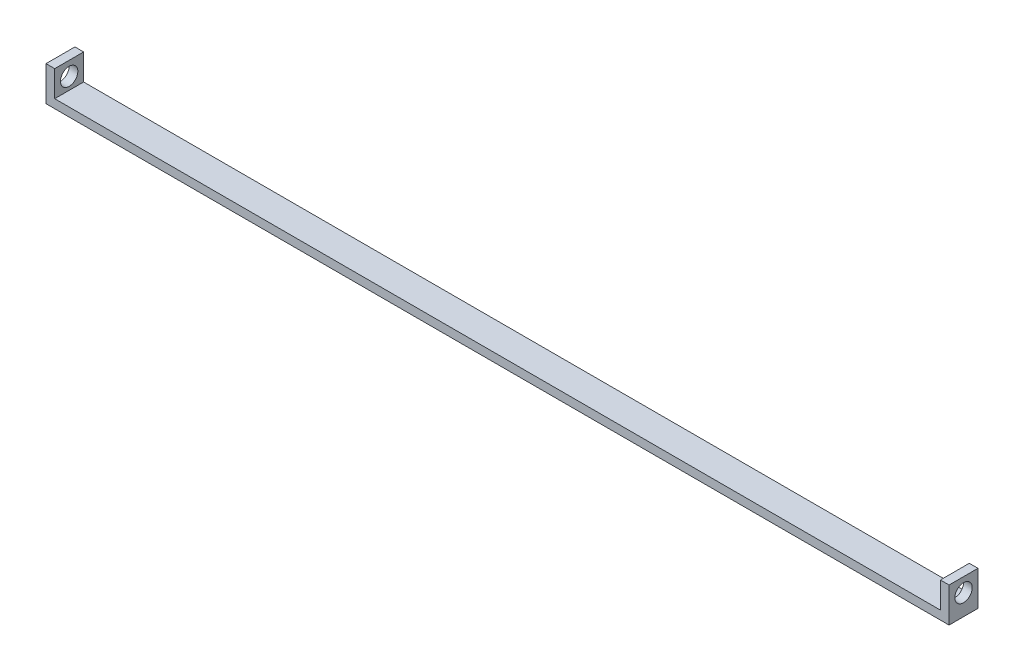
ISO-10303-21;
HEADER;
FILE_DESCRIPTION(('STEP AP214'),'2;1');
FILE_NAME('part.step','',(''),(''),'','','');
FILE_SCHEMA(('AUTOMOTIVE_DESIGN { 1 0 10303 214 1 1 1 1 }'));
ENDSEC;
DATA;
#1=APPLICATION_CONTEXT('core data for automotive mechanical design processes');
#2=APPLICATION_PROTOCOL_DEFINITION('international standard','automotive_design',2000,#1);
#3=PRODUCT_CONTEXT('',#1,'mechanical');
#4=PRODUCT('Part','Part','',(#3));
#5=PRODUCT_RELATED_PRODUCT_CATEGORY('part','',(#4));
#6=PRODUCT_DEFINITION_FORMATION('','',#4);
#7=PRODUCT_DEFINITION_CONTEXT('part definition',#1,'design');
#8=PRODUCT_DEFINITION('design','',#6,#7);
#9=PRODUCT_DEFINITION_SHAPE('','',#8);
#10=(LENGTH_UNIT() NAMED_UNIT(*) SI_UNIT(.MILLI.,.METRE.));
#11=(NAMED_UNIT(*) PLANE_ANGLE_UNIT() SI_UNIT($,.RADIAN.));
#12=(NAMED_UNIT(*) SI_UNIT($,.STERADIAN.) SOLID_ANGLE_UNIT());
#13=UNCERTAINTY_MEASURE_WITH_UNIT(LENGTH_MEASURE(1.E-05),#10,'distance_accuracy_value','');
#14=(GEOMETRIC_REPRESENTATION_CONTEXT(3) GLOBAL_UNCERTAINTY_ASSIGNED_CONTEXT((#13)) GLOBAL_UNIT_ASSIGNED_CONTEXT((#10,
#11,#12)) REPRESENTATION_CONTEXT('',''));
#15=CARTESIAN_POINT('',(0.,0.,0.));
#16=DIRECTION('',(0.,0.,1.));
#17=DIRECTION('',(1.,0.,0.));
#18=AXIS2_PLACEMENT_3D('',#15,#16,#17);
#19=CARTESIAN_POINT('',(78.,-0.629032258064505,5.));
#20=DIRECTION('',(0.,1.,0.));
#21=DIRECTION('',(-1.,0.,0.));
#22=AXIS2_PLACEMENT_3D('',#19,#20,#21);
#23=PLANE('',#22);
#24=DIRECTION('',(1.,0.,0.));
#25=VECTOR('',#24,1.);
#26=CARTESIAN_POINT('',(78.,-0.629032258064505,0.));
#27=LINE('',#26,#25);
#28=CARTESIAN_POINT('',(-78.,-0.629032258064552,0.));
#29=VERTEX_POINT('',#28);
#30=CARTESIAN_POINT('',(78.,-0.629032258064505,0.));
#31=VERTEX_POINT('',#30);
#32=EDGE_CURVE('E133',#29,#31,#27,.T.);
#33=ORIENTED_EDGE('',*,*,#32,.T.);
#34=DIRECTION('',(0.,0.,-1.));
#35=VECTOR('',#34,1.);
#36=CARTESIAN_POINT('',(78.,-0.629032258064505,5.));
#37=LINE('',#36,#35);
#38=CARTESIAN_POINT('',(78.,-0.629032258064505,5.));
#39=VERTEX_POINT('',#38);
#40=EDGE_CURVE('E41',#39,#31,#37,.T.);
#41=ORIENTED_EDGE('',*,*,#40,.F.);
#42=DIRECTION('',(1.,0.,0.));
#43=VECTOR('',#42,1.);
#44=CARTESIAN_POINT('',(78.,-0.629032258064505,5.));
#45=LINE('',#44,#43);
#46=CARTESIAN_POINT('',(-78.,-0.629032258064552,5.));
#47=VERTEX_POINT('',#46);
#48=EDGE_CURVE('E93',#47,#39,#45,.T.);
#49=ORIENTED_EDGE('',*,*,#48,.F.);
#50=DIRECTION('',(0.,0.,-1.));
#51=VECTOR('',#50,1.);
#52=CARTESIAN_POINT('',(-78.,-0.629032258064552,5.));
#53=LINE('',#52,#51);
#54=EDGE_CURVE('E11',#47,#29,#53,.T.);
#55=ORIENTED_EDGE('',*,*,#54,.T.);
#56=EDGE_LOOP('',(#33,#41,#49,#55));
#57=FACE_BOUND('',#56,.T.);
#58=ADVANCED_FACE('F33',(#57),#23,.F.);
#59=CARTESIAN_POINT('',(78.,0.629032258064527,5.));
#60=DIRECTION('',(-1.,0.,0.));
#61=DIRECTION('',(0.,0.,1.));
#62=AXIS2_PLACEMENT_3D('',#59,#60,#61);
#63=PLANE('',#62);
#64=CARTESIAN_POINT('',(78.,2.97096774193545,2.5));
#65=DIRECTION('',(-1.,0.,0.));
#66=DIRECTION('',(0.,0.,1.));
#67=AXIS2_PLACEMENT_3D('',#64,#65,#66);
#68=CIRCLE('',#67,1.5);
#69=CARTESIAN_POINT('',(78.,2.97096774193545,4.));
#70=VERTEX_POINT('',#69);
#71=EDGE_CURVE('E137',#70,#70,#68,.T.);
#72=ORIENTED_EDGE('',*,*,#71,.T.);
#73=EDGE_LOOP('',(#72));
#74=FACE_BOUND('',#73,.T.);
#75=DIRECTION('',(0.,1.,0.));
#76=VECTOR('',#75,1.);
#77=CARTESIAN_POINT('',(78.,0.629032258064527,0.));
#78=LINE('',#77,#76);
#79=CARTESIAN_POINT('',(78.,5.37096774193545,0.));
#80=VERTEX_POINT('',#79);
#81=EDGE_CURVE('E136',#31,#80,#78,.T.);
#82=ORIENTED_EDGE('',*,*,#81,.T.);
#83=DIRECTION('',(0.,0.,-1.));
#84=VECTOR('',#83,1.);
#85=CARTESIAN_POINT('',(78.,5.37096774193545,5.));
#86=LINE('',#85,#84);
#87=CARTESIAN_POINT('',(78.,5.37096774193545,5.));
#88=VERTEX_POINT('',#87);
#89=EDGE_CURVE('E154',#88,#80,#86,.T.);
#90=ORIENTED_EDGE('',*,*,#89,.F.);
#91=DIRECTION('',(0.,1.,0.));
#92=VECTOR('',#91,1.);
#93=CARTESIAN_POINT('',(78.,0.629032258064527,5.));
#94=LINE('',#93,#92);
#95=EDGE_CURVE('E161',#39,#88,#94,.T.);
#96=ORIENTED_EDGE('',*,*,#95,.F.);
#97=ORIENTED_EDGE('',*,*,#40,.T.);
#98=EDGE_LOOP('',(#82,#90,#96,#97));
#99=FACE_BOUND('',#98,.T.);
#100=ADVANCED_FACE('F159',(#74,#99),#63,.F.);
#101=CARTESIAN_POINT('',(78.,5.37096774193545,5.));
#102=DIRECTION('',(0.,-1.,0.));
#103=DIRECTION('',(0.,0.,-1.));
#104=AXIS2_PLACEMENT_3D('',#101,#102,#103);
#105=PLANE('',#104);
#106=DIRECTION('',(-1.,0.,0.));
#107=VECTOR('',#106,1.);
#108=CARTESIAN_POINT('',(78.,5.37096774193545,0.));
#109=LINE('',#108,#107);
#110=CARTESIAN_POINT('',(76.5,5.37096774193545,0.));
#111=VERTEX_POINT('',#110);
#112=EDGE_CURVE('E139',#80,#111,#109,.T.);
#113=ORIENTED_EDGE('',*,*,#112,.T.);
#114=DIRECTION('',(0.,0.,-1.));
#115=VECTOR('',#114,1.);
#116=CARTESIAN_POINT('',(76.5,5.37096774193545,5.));
#117=LINE('',#116,#115);
#118=CARTESIAN_POINT('',(76.5,5.37096774193545,5.));
#119=VERTEX_POINT('',#118);
#120=EDGE_CURVE('E151',#119,#111,#117,.T.);
#121=ORIENTED_EDGE('',*,*,#120,.F.);
#122=DIRECTION('',(-1.,0.,0.));
#123=VECTOR('',#122,1.);
#124=CARTESIAN_POINT('',(78.,5.37096774193545,5.));
#125=LINE('',#124,#123);
#126=EDGE_CURVE('E174',#88,#119,#125,.T.);
#127=ORIENTED_EDGE('',*,*,#126,.F.);
#128=ORIENTED_EDGE('',*,*,#89,.T.);
#129=EDGE_LOOP('',(#113,#121,#127,#128));
#130=FACE_BOUND('',#129,.T.);
#131=ADVANCED_FACE('F170',(#130),#105,.F.);
#132=CARTESIAN_POINT('',(76.5,0.870967741935448,5.));
#133=DIRECTION('',(1.,0.,0.));
#134=DIRECTION('',(0.,0.,-1.));
#135=AXIS2_PLACEMENT_3D('',#132,#133,#134);
#136=PLANE('',#135);
#137=CARTESIAN_POINT('',(76.5,2.97096774193545,2.5));
#138=DIRECTION('',(1.,0.,0.));
#139=DIRECTION('',(0.,0.,-1.));
#140=AXIS2_PLACEMENT_3D('',#137,#138,#139);
#141=CIRCLE('',#140,1.5);
#142=CARTESIAN_POINT('',(76.5,2.97096774193545,4.));
#143=VERTEX_POINT('',#142);
#144=EDGE_CURVE('E182',#143,#143,#141,.T.);
#145=ORIENTED_EDGE('',*,*,#144,.T.);
#146=EDGE_LOOP('',(#145));
#147=FACE_BOUND('',#146,.T.);
#148=DIRECTION('',(0.,-1.,0.));
#149=VECTOR('',#148,1.);
#150=CARTESIAN_POINT('',(76.5,0.870967741935448,0.));
#151=LINE('',#150,#149);
#152=CARTESIAN_POINT('',(76.5,0.870967741935448,0.));
#153=VERTEX_POINT('',#152);
#154=EDGE_CURVE('E141',#111,#153,#151,.T.);
#155=ORIENTED_EDGE('',*,*,#154,.T.);
#156=DIRECTION('',(0.,0.,-1.));
#157=VECTOR('',#156,1.);
#158=CARTESIAN_POINT('',(76.5,0.870967741935448,5.));
#159=LINE('',#158,#157);
#160=CARTESIAN_POINT('',(76.5,0.870967741935448,5.));
#161=VERTEX_POINT('',#160);
#162=EDGE_CURVE('E122',#161,#153,#159,.T.);
#163=ORIENTED_EDGE('',*,*,#162,.F.);
#164=DIRECTION('',(0.,-1.,0.));
#165=VECTOR('',#164,1.);
#166=CARTESIAN_POINT('',(76.5,0.870967741935448,5.));
#167=LINE('',#166,#165);
#168=EDGE_CURVE('E113',#119,#161,#167,.T.);
#169=ORIENTED_EDGE('',*,*,#168,.F.);
#170=ORIENTED_EDGE('',*,*,#120,.T.);
#171=EDGE_LOOP('',(#155,#163,#169,#170));
#172=FACE_BOUND('',#171,.T.);
#173=ADVANCED_FACE('F173',(#147,#172),#136,.F.);
#174=CARTESIAN_POINT('',(76.5,0.870967741935448,5.));
#175=DIRECTION('',(0.,-1.,0.));
#176=DIRECTION('',(0.,0.,-1.));
#177=AXIS2_PLACEMENT_3D('',#174,#175,#176);
#178=PLANE('',#177);
#179=DIRECTION('',(-1.,0.,0.));
#180=VECTOR('',#179,1.);
#181=CARTESIAN_POINT('',(76.5,0.870967741935448,0.));
#182=LINE('',#181,#180);
#183=CARTESIAN_POINT('',(-76.5,0.870967741935448,0.));
#184=VERTEX_POINT('',#183);
#185=EDGE_CURVE('E121',#153,#184,#182,.T.);
#186=ORIENTED_EDGE('',*,*,#185,.T.);
#187=DIRECTION('',(0.,0.,-1.));
#188=VECTOR('',#187,1.);
#189=CARTESIAN_POINT('',(-76.5,0.870967741935448,5.));
#190=LINE('',#189,#188);
#191=CARTESIAN_POINT('',(-76.5,0.870967741935448,5.));
#192=VERTEX_POINT('',#191);
#193=EDGE_CURVE('E118',#192,#184,#190,.T.);
#194=ORIENTED_EDGE('',*,*,#193,.F.);
#195=DIRECTION('',(-1.,0.,0.));
#196=VECTOR('',#195,1.);
#197=CARTESIAN_POINT('',(76.5,0.870967741935448,5.));
#198=LINE('',#197,#196);
#199=EDGE_CURVE('E107',#161,#192,#198,.T.);
#200=ORIENTED_EDGE('',*,*,#199,.F.);
#201=ORIENTED_EDGE('',*,*,#162,.T.);
#202=EDGE_LOOP('',(#186,#194,#200,#201));
#203=FACE_BOUND('',#202,.T.);
#204=ADVANCED_FACE('F119',(#203),#178,.F.);
#205=CARTESIAN_POINT('',(-76.5,0.870967741935448,5.));
#206=DIRECTION('',(-1.,0.,0.));
#207=DIRECTION('',(0.,0.,1.));
#208=AXIS2_PLACEMENT_3D('',#205,#206,#207);
#209=PLANE('',#208);
#210=CARTESIAN_POINT('',(-76.5,2.97096774193545,2.5));
#211=DIRECTION('',(-1.,0.,0.));
#212=DIRECTION('',(0.,0.,1.));
#213=AXIS2_PLACEMENT_3D('',#210,#211,#212);
#214=CIRCLE('',#213,1.5);
#215=CARTESIAN_POINT('',(-76.5,2.97096774193545,4.));
#216=VERTEX_POINT('',#215);
#217=EDGE_CURVE('E185',#216,#216,#214,.T.);
#218=ORIENTED_EDGE('',*,*,#217,.T.);
#219=EDGE_LOOP('',(#218));
#220=FACE_BOUND('',#219,.T.);
#221=DIRECTION('',(0.,1.,0.));
#222=VECTOR('',#221,1.);
#223=CARTESIAN_POINT('',(-76.5,0.870967741935448,0.));
#224=LINE('',#223,#222);
#225=CARTESIAN_POINT('',(-76.5,5.37096774193545,0.));
#226=VERTEX_POINT('',#225);
#227=EDGE_CURVE('E79',#184,#226,#224,.T.);
#228=ORIENTED_EDGE('',*,*,#227,.T.);
#229=DIRECTION('',(0.,0.,-1.));
#230=VECTOR('',#229,1.);
#231=CARTESIAN_POINT('',(-76.5,5.37096774193545,5.));
#232=LINE('',#231,#230);
#233=CARTESIAN_POINT('',(-76.5,5.37096774193545,5.));
#234=VERTEX_POINT('',#233);
#235=EDGE_CURVE('E123',#234,#226,#232,.T.);
#236=ORIENTED_EDGE('',*,*,#235,.F.);
#237=DIRECTION('',(0.,1.,0.));
#238=VECTOR('',#237,1.);
#239=CARTESIAN_POINT('',(-76.5,0.870967741935448,5.));
#240=LINE('',#239,#238);
#241=EDGE_CURVE('E111',#192,#234,#240,.T.);
#242=ORIENTED_EDGE('',*,*,#241,.F.);
#243=ORIENTED_EDGE('',*,*,#193,.T.);
#244=EDGE_LOOP('',(#228,#236,#242,#243));
#245=FACE_BOUND('',#244,.T.);
#246=ADVANCED_FACE('F125',(#220,#245),#209,.F.);
#247=CARTESIAN_POINT('',(-78.,5.37096774193545,5.));
#248=DIRECTION('',(0.,-1.,0.));
#249=DIRECTION('',(0.,0.,-1.));
#250=AXIS2_PLACEMENT_3D('',#247,#248,#249);
#251=PLANE('',#250);
#252=DIRECTION('',(-1.,0.,0.));
#253=VECTOR('',#252,1.);
#254=CARTESIAN_POINT('',(-78.,5.37096774193545,0.));
#255=LINE('',#254,#253);
#256=CARTESIAN_POINT('',(-78.,5.37096774193545,0.));
#257=VERTEX_POINT('',#256);
#258=EDGE_CURVE('E86',#226,#257,#255,.T.);
#259=ORIENTED_EDGE('',*,*,#258,.T.);
#260=DIRECTION('',(0.,0.,-1.));
#261=VECTOR('',#260,1.);
#262=CARTESIAN_POINT('',(-78.,5.37096774193545,5.));
#263=LINE('',#262,#261);
#264=CARTESIAN_POINT('',(-78.,5.37096774193545,5.));
#265=VERTEX_POINT('',#264);
#266=EDGE_CURVE('E129',#265,#257,#263,.T.);
#267=ORIENTED_EDGE('',*,*,#266,.F.);
#268=DIRECTION('',(-1.,0.,0.));
#269=VECTOR('',#268,1.);
#270=CARTESIAN_POINT('',(-78.,5.37096774193545,5.));
#271=LINE('',#270,#269);
#272=EDGE_CURVE('E127',#234,#265,#271,.T.);
#273=ORIENTED_EDGE('',*,*,#272,.F.);
#274=ORIENTED_EDGE('',*,*,#235,.T.);
#275=EDGE_LOOP('',(#259,#267,#273,#274));
#276=FACE_BOUND('',#275,.T.);
#277=ADVANCED_FACE('F197',(#276),#251,.F.);
#278=CARTESIAN_POINT('',(-78.,0.629032258064537,5.));
#279=DIRECTION('',(1.,0.,0.));
#280=DIRECTION('',(0.,0.,-1.));
#281=AXIS2_PLACEMENT_3D('',#278,#279,#280);
#282=PLANE('',#281);
#283=CARTESIAN_POINT('',(-78.,2.97096774193545,2.5));
#284=DIRECTION('',(-1.,0.,0.));
#285=DIRECTION('',(0.,0.,1.));
#286=AXIS2_PLACEMENT_3D('',#283,#284,#285);
#287=CIRCLE('',#286,1.5);
#288=CARTESIAN_POINT('',(-78.,2.97096774193545,4.));
#289=VERTEX_POINT('',#288);
#290=EDGE_CURVE('E188',#289,#289,#287,.T.);
#291=ORIENTED_EDGE('',*,*,#290,.F.);
#292=EDGE_LOOP('',(#291));
#293=FACE_BOUND('',#292,.T.);
#294=DIRECTION('',(0.,-1.,0.));
#295=VECTOR('',#294,1.);
#296=CARTESIAN_POINT('',(-78.,0.629032258064537,0.));
#297=LINE('',#296,#295);
#298=EDGE_CURVE('E146',#257,#29,#297,.T.);
#299=ORIENTED_EDGE('',*,*,#298,.T.);
#300=ORIENTED_EDGE('',*,*,#54,.F.);
#301=DIRECTION('',(0.,-1.,0.));
#302=VECTOR('',#301,1.);
#303=CARTESIAN_POINT('',(-78.,0.629032258064537,5.));
#304=LINE('',#303,#302);
#305=EDGE_CURVE('E49',#265,#47,#304,.T.);
#306=ORIENTED_EDGE('',*,*,#305,.F.);
#307=ORIENTED_EDGE('',*,*,#266,.T.);
#308=EDGE_LOOP('',(#299,#300,#306,#307));
#309=FACE_BOUND('',#308,.T.);
#310=ADVANCED_FACE('F195',(#293,#309),#282,.F.);
#311=CARTESIAN_POINT('',(0.,0.,5.));
#312=DIRECTION('',(0.,0.,-1.));
#313=DIRECTION('',(-1.,0.,0.));
#314=AXIS2_PLACEMENT_3D('',#311,#312,#313);
#315=PLANE('',#314);
#316=ORIENTED_EDGE('',*,*,#305,.T.);
#317=ORIENTED_EDGE('',*,*,#48,.T.);
#318=ORIENTED_EDGE('',*,*,#95,.T.);
#319=ORIENTED_EDGE('',*,*,#126,.T.);
#320=ORIENTED_EDGE('',*,*,#168,.T.);
#321=ORIENTED_EDGE('',*,*,#199,.T.);
#322=ORIENTED_EDGE('',*,*,#241,.T.);
#323=ORIENTED_EDGE('',*,*,#272,.T.);
#324=EDGE_LOOP('',(#316,#317,#318,#319,#320,#321,#322,#323));
#325=FACE_BOUND('',#324,.T.);
#326=ADVANCED_FACE('F109',(#325),#315,.F.);
#327=CARTESIAN_POINT('',(0.,0.,0.));
#328=DIRECTION('',(0.,0.,-1.));
#329=DIRECTION('',(-1.,0.,0.));
#330=AXIS2_PLACEMENT_3D('',#327,#328,#329);
#331=PLANE('',#330);
#332=ORIENTED_EDGE('',*,*,#32,.F.);
#333=ORIENTED_EDGE('',*,*,#298,.F.);
#334=ORIENTED_EDGE('',*,*,#258,.F.);
#335=ORIENTED_EDGE('',*,*,#227,.F.);
#336=ORIENTED_EDGE('',*,*,#185,.F.);
#337=ORIENTED_EDGE('',*,*,#154,.F.);
#338=ORIENTED_EDGE('',*,*,#112,.F.);
#339=ORIENTED_EDGE('',*,*,#81,.F.);
#340=EDGE_LOOP('',(#332,#333,#334,#335,#336,#337,#338,#339));
#341=FACE_BOUND('',#340,.T.);
#342=ADVANCED_FACE('F165',(#341),#331,.T.);
#343=CARTESIAN_POINT('',(240.,2.97096774193545,2.5));
#344=DIRECTION('',(-1.,0.,0.));
#345=DIRECTION('',(0.,0.,1.));
#346=AXIS2_PLACEMENT_3D('',#343,#344,#345);
#347=CYLINDRICAL_SURFACE('',#346,1.5);
#348=CARTESIAN_POINT('',(-78.,2.97096774193545,4.));
#349=CARTESIAN_POINT('',(-77.984375,2.97096774193545,4.));
#350=CARTESIAN_POINT('',(-77.96875,2.97096774193545,4.));
#351=CARTESIAN_POINT('',(-77.9375,2.97096774193545,4.));
#352=CARTESIAN_POINT('',(-77.921875,2.97096774193545,4.));
#353=CARTESIAN_POINT('',(-77.890625,2.97096774193545,4.));
#354=CARTESIAN_POINT('',(-77.875,2.97096774193545,4.));
#355=CARTESIAN_POINT('',(-77.84375,2.97096774193545,4.));
#356=CARTESIAN_POINT('',(-77.828125,2.97096774193545,4.));
#357=CARTESIAN_POINT('',(-77.796875,2.97096774193545,4.));
#358=CARTESIAN_POINT('',(-77.78125,2.97096774193545,4.));
#359=CARTESIAN_POINT('',(-77.75,2.97096774193545,4.));
#360=CARTESIAN_POINT('',(-77.734375,2.97096774193545,4.));
#361=CARTESIAN_POINT('',(-77.703125,2.97096774193545,4.));
#362=CARTESIAN_POINT('',(-77.6875,2.97096774193545,4.));
#363=CARTESIAN_POINT('',(-77.65625,2.97096774193545,4.));
#364=CARTESIAN_POINT('',(-77.640625,2.97096774193545,4.));
#365=CARTESIAN_POINT('',(-77.609375,2.97096774193545,4.));
#366=CARTESIAN_POINT('',(-77.59375,2.97096774193545,4.));
#367=CARTESIAN_POINT('',(-77.5625,2.97096774193545,4.));
#368=CARTESIAN_POINT('',(-77.546875,2.97096774193545,4.));
#369=CARTESIAN_POINT('',(-77.515625,2.97096774193545,4.));
#370=CARTESIAN_POINT('',(-77.5,2.97096774193545,4.));
#371=CARTESIAN_POINT('',(-77.46875,2.97096774193545,4.));
#372=CARTESIAN_POINT('',(-77.453125,2.97096774193545,4.));
#373=CARTESIAN_POINT('',(-77.421875,2.97096774193545,4.));
#374=CARTESIAN_POINT('',(-77.40625,2.97096774193545,4.));
#375=CARTESIAN_POINT('',(-77.375,2.97096774193545,4.));
#376=CARTESIAN_POINT('',(-77.359375,2.97096774193545,4.));
#377=CARTESIAN_POINT('',(-77.328125,2.97096774193545,4.));
#378=CARTESIAN_POINT('',(-77.3125,2.97096774193545,4.));
#379=CARTESIAN_POINT('',(-77.28125,2.97096774193545,4.));
#380=CARTESIAN_POINT('',(-77.265625,2.97096774193545,4.));
#381=CARTESIAN_POINT('',(-77.234375,2.97096774193545,4.));
#382=CARTESIAN_POINT('',(-77.21875,2.97096774193545,4.));
#383=CARTESIAN_POINT('',(-77.1875,2.97096774193545,4.));
#384=CARTESIAN_POINT('',(-77.171875,2.97096774193545,4.));
#385=CARTESIAN_POINT('',(-77.140625,2.97096774193545,4.));
#386=CARTESIAN_POINT('',(-77.125,2.97096774193545,4.));
#387=CARTESIAN_POINT('',(-77.09375,2.97096774193545,4.));
#388=CARTESIAN_POINT('',(-77.078125,2.97096774193545,4.));
#389=CARTESIAN_POINT('',(-77.046875,2.97096774193545,4.));
#390=CARTESIAN_POINT('',(-77.03125,2.97096774193545,4.));
#391=CARTESIAN_POINT('',(-77.,2.97096774193545,4.));
#392=CARTESIAN_POINT('',(-76.984375,2.97096774193545,4.));
#393=CARTESIAN_POINT('',(-76.953125,2.97096774193545,4.));
#394=CARTESIAN_POINT('',(-76.9375,2.97096774193545,4.));
#395=CARTESIAN_POINT('',(-76.90625,2.97096774193545,4.));
#396=CARTESIAN_POINT('',(-76.890625,2.97096774193545,4.));
#397=CARTESIAN_POINT('',(-76.859375,2.97096774193545,4.));
#398=CARTESIAN_POINT('',(-76.84375,2.97096774193545,4.));
#399=CARTESIAN_POINT('',(-76.8125,2.97096774193545,4.));
#400=CARTESIAN_POINT('',(-76.796875,2.97096774193545,4.));
#401=CARTESIAN_POINT('',(-76.765625,2.97096774193545,4.));
#402=CARTESIAN_POINT('',(-76.75,2.97096774193545,4.));
#403=CARTESIAN_POINT('',(-76.71875,2.97096774193545,4.));
#404=CARTESIAN_POINT('',(-76.703125,2.97096774193545,4.));
#405=CARTESIAN_POINT('',(-76.671875,2.97096774193545,4.));
#406=CARTESIAN_POINT('',(-76.65625,2.97096774193545,4.));
#407=CARTESIAN_POINT('',(-76.625,2.97096774193545,4.));
#408=CARTESIAN_POINT('',(-76.609375,2.97096774193545,4.));
#409=CARTESIAN_POINT('',(-76.578125,2.97096774193545,4.));
#410=CARTESIAN_POINT('',(-76.5625,2.97096774193545,4.));
#411=CARTESIAN_POINT('',(-76.53125,2.97096774193545,4.));
#412=CARTESIAN_POINT('',(-76.515625,2.97096774193545,4.));
#413=CARTESIAN_POINT('',(-76.5,2.97096774193545,4.));
#414=B_SPLINE_CURVE_WITH_KNOTS('',3,(#348,#349,#350,#351,#352,#353,#354,#355,#356,#357,#358,
#359,#360,#361,#362,#363,#364,#365,#366,#367,#368,#369,#370,#371,#372,#373,#374,#375,#376,#377,
#378,#379,#380,#381,#382,#383,#384,#385,#386,#387,#388,#389,#390,#391,#392,#393,#394,#395,#396,
#397,#398,#399,#400,#401,#402,#403,#404,#405,#406,#407,#408,#409,#410,#411,#412,#413),
.UNSPECIFIED.,.F.,.F.,(4,2,2,2,2,2,2,2,2,2,2,2,2,2,2,2,2,2,2,2,2,2,2,2,2,2,2,2,2,2,2,2,4),(0.,
0.0468750000000018,0.0937500000000036,0.140625000000005,0.187500000000007,0.234375000000009,
0.281250000000011,0.328125000000012,0.375000000000014,0.421875000000016,0.468750000000018,
0.51562500000002,0.562500000000021,0.609375000000023,0.656250000000025,0.703125000000027,
0.750000000000028,0.79687500000003,0.843750000000032,0.890625000000034,0.937500000000036,
0.984375000000037,1.03125000000004,1.07812500000004,1.12500000000004,1.17187500000004,
1.21875000000005,1.26562500000005,1.31250000000005,1.35937500000005,1.40625000000005,
1.45312500000006,1.50000000000006),.UNSPECIFIED.);
#415=EDGE_CURVE('BSEAM192',#289,#216,#414,.T.);
#416=ORIENTED_EDGE('',*,*,#290,.T.);
#417=ORIENTED_EDGE('',*,*,#217,.F.);
#418=ORIENTED_EDGE('',*,*,#415,.T.);
#419=ORIENTED_EDGE('',*,*,#415,.F.);
#420=EDGE_LOOP('',(#416,#418,#417,#419));
#421=FACE_BOUND('',#420,.T.);
#422=ADVANCED_FACE('F192',(#421),#347,.F.);
#423=CARTESIAN_POINT('',(76.5,2.97096774193545,4.));
#424=CARTESIAN_POINT('',(76.515625,2.97096774193545,4.));
#425=CARTESIAN_POINT('',(76.53125,2.97096774193545,4.));
#426=CARTESIAN_POINT('',(76.5625,2.97096774193545,4.));
#427=CARTESIAN_POINT('',(76.578125,2.97096774193545,4.));
#428=CARTESIAN_POINT('',(76.609375,2.97096774193545,4.));
#429=CARTESIAN_POINT('',(76.625,2.97096774193545,4.));
#430=CARTESIAN_POINT('',(76.65625,2.97096774193545,4.));
#431=CARTESIAN_POINT('',(76.671875,2.97096774193545,4.));
#432=CARTESIAN_POINT('',(76.703125,2.97096774193545,4.));
#433=CARTESIAN_POINT('',(76.71875,2.97096774193545,4.));
#434=CARTESIAN_POINT('',(76.75,2.97096774193545,4.));
#435=CARTESIAN_POINT('',(76.765625,2.97096774193545,4.));
#436=CARTESIAN_POINT('',(76.796875,2.97096774193545,4.));
#437=CARTESIAN_POINT('',(76.8125,2.97096774193545,4.));
#438=CARTESIAN_POINT('',(76.84375,2.97096774193545,4.));
#439=CARTESIAN_POINT('',(76.859375,2.97096774193545,4.));
#440=CARTESIAN_POINT('',(76.890625,2.97096774193545,4.));
#441=CARTESIAN_POINT('',(76.90625,2.97096774193545,4.));
#442=CARTESIAN_POINT('',(76.9375,2.97096774193545,4.));
#443=CARTESIAN_POINT('',(76.953125,2.97096774193545,4.));
#444=CARTESIAN_POINT('',(76.984375,2.97096774193545,4.));
#445=CARTESIAN_POINT('',(77.,2.97096774193545,4.));
#446=CARTESIAN_POINT('',(77.03125,2.97096774193545,4.));
#447=CARTESIAN_POINT('',(77.046875,2.97096774193545,4.));
#448=CARTESIAN_POINT('',(77.078125,2.97096774193545,4.));
#449=CARTESIAN_POINT('',(77.09375,2.97096774193545,4.));
#450=CARTESIAN_POINT('',(77.125,2.97096774193545,4.));
#451=CARTESIAN_POINT('',(77.140625,2.97096774193545,4.));
#452=CARTESIAN_POINT('',(77.171875,2.97096774193545,4.));
#453=CARTESIAN_POINT('',(77.1875,2.97096774193545,4.));
#454=CARTESIAN_POINT('',(77.21875,2.97096774193545,4.));
#455=CARTESIAN_POINT('',(77.234375,2.97096774193545,4.));
#456=CARTESIAN_POINT('',(77.265625,2.97096774193545,4.));
#457=CARTESIAN_POINT('',(77.28125,2.97096774193545,4.));
#458=CARTESIAN_POINT('',(77.3125,2.97096774193545,4.));
#459=CARTESIAN_POINT('',(77.328125,2.97096774193545,4.));
#460=CARTESIAN_POINT('',(77.359375,2.97096774193545,4.));
#461=CARTESIAN_POINT('',(77.375,2.97096774193545,4.));
#462=CARTESIAN_POINT('',(77.40625,2.97096774193545,4.));
#463=CARTESIAN_POINT('',(77.421875,2.97096774193545,4.));
#464=CARTESIAN_POINT('',(77.453125,2.97096774193545,4.));
#465=CARTESIAN_POINT('',(77.46875,2.97096774193545,4.));
#466=CARTESIAN_POINT('',(77.5,2.97096774193545,4.));
#467=CARTESIAN_POINT('',(77.515625,2.97096774193545,4.));
#468=CARTESIAN_POINT('',(77.546875,2.97096774193545,4.));
#469=CARTESIAN_POINT('',(77.5625,2.97096774193545,4.));
#470=CARTESIAN_POINT('',(77.59375,2.97096774193545,4.));
#471=CARTESIAN_POINT('',(77.609375,2.97096774193545,4.));
#472=CARTESIAN_POINT('',(77.640625,2.97096774193545,4.));
#473=CARTESIAN_POINT('',(77.65625,2.97096774193545,4.));
#474=CARTESIAN_POINT('',(77.6875,2.97096774193545,4.));
#475=CARTESIAN_POINT('',(77.703125,2.97096774193545,4.));
#476=CARTESIAN_POINT('',(77.734375,2.97096774193545,4.));
#477=CARTESIAN_POINT('',(77.75,2.97096774193545,4.));
#478=CARTESIAN_POINT('',(77.78125,2.97096774193545,4.));
#479=CARTESIAN_POINT('',(77.796875,2.97096774193545,4.));
#480=CARTESIAN_POINT('',(77.828125,2.97096774193545,4.));
#481=CARTESIAN_POINT('',(77.84375,2.97096774193545,4.));
#482=CARTESIAN_POINT('',(77.875,2.97096774193545,4.));
#483=CARTESIAN_POINT('',(77.890625,2.97096774193545,4.));
#484=CARTESIAN_POINT('',(77.921875,2.97096774193545,4.));
#485=CARTESIAN_POINT('',(77.9375,2.97096774193545,4.));
#486=CARTESIAN_POINT('',(77.96875,2.97096774193545,4.));
#487=CARTESIAN_POINT('',(77.984375,2.97096774193545,4.));
#488=CARTESIAN_POINT('',(78.,2.97096774193545,4.));
#489=B_SPLINE_CURVE_WITH_KNOTS('',3,(#423,#424,#425,#426,#427,#428,#429,#430,#431,#432,#433,
#434,#435,#436,#437,#438,#439,#440,#441,#442,#443,#444,#445,#446,#447,#448,#449,#450,#451,#452,
#453,#454,#455,#456,#457,#458,#459,#460,#461,#462,#463,#464,#465,#466,#467,#468,#469,#470,#471,
#472,#473,#474,#475,#476,#477,#478,#479,#480,#481,#482,#483,#484,#485,#486,#487,#488),
.UNSPECIFIED.,.F.,.F.,(4,2,2,2,2,2,2,2,2,2,2,2,2,2,2,2,2,2,2,2,2,2,2,2,2,2,2,2,2,2,2,2,4),(0.,
0.0468750000000018,0.0937500000000036,0.140625000000005,0.187500000000007,0.234375000000009,
0.281250000000011,0.328125000000012,0.375000000000014,0.421875000000016,0.468750000000018,
0.51562500000002,0.562500000000021,0.609375000000023,0.656250000000025,0.703125000000027,
0.750000000000028,0.79687500000003,0.843750000000032,0.890625000000034,0.937500000000036,
0.984375000000037,1.03125000000004,1.07812500000004,1.12500000000004,1.17187500000004,
1.21875000000005,1.26562500000005,1.31250000000005,1.35937500000005,1.40625000000005,
1.45312500000006,1.50000000000006),.UNSPECIFIED.);
#490=EDGE_CURVE('BSEAM250',#143,#70,#489,.T.);
#491=ORIENTED_EDGE('',*,*,#144,.F.);
#492=ORIENTED_EDGE('',*,*,#71,.F.);
#493=ORIENTED_EDGE('',*,*,#490,.T.);
#494=ORIENTED_EDGE('',*,*,#490,.F.);
#495=EDGE_LOOP('',(#491,#493,#492,#494));
#496=FACE_BOUND('',#495,.T.);
#497=ADVANCED_FACE('F250',(#496),#347,.F.);
#498=CLOSED_SHELL('',(#58,#100,#131,#173,#204,#246,#277,#310,#326,#342,#422,#497));
#499=MANIFOLD_SOLID_BREP('B2',#498);
#500=ADVANCED_BREP_SHAPE_REPRESENTATION('',(#18,#499),#14);
#501=SHAPE_DEFINITION_REPRESENTATION(#9,#500);
ENDSEC;
END-ISO-10303-21;
